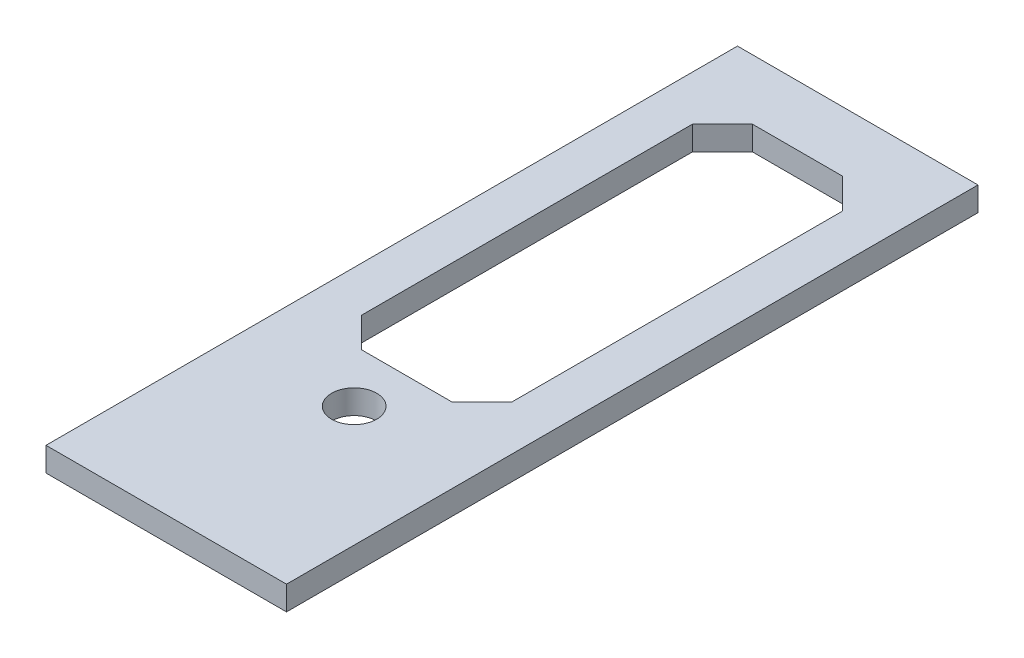
ISO-10303-21;
HEADER;
FILE_DESCRIPTION(('STEP AP214'),'2;1');
FILE_NAME('part.step','',(''),(''),'','','');
FILE_SCHEMA(('AUTOMOTIVE_DESIGN { 1 0 10303 214 1 1 1 1 }'));
ENDSEC;
DATA;
#1=APPLICATION_CONTEXT('core data for automotive mechanical design processes');
#2=APPLICATION_PROTOCOL_DEFINITION('international standard','automotive_design',2000,#1);
#3=PRODUCT_CONTEXT('',#1,'mechanical');
#4=PRODUCT('Part','Part','',(#3));
#5=PRODUCT_RELATED_PRODUCT_CATEGORY('part','',(#4));
#6=PRODUCT_DEFINITION_FORMATION('','',#4);
#7=PRODUCT_DEFINITION_CONTEXT('part definition',#1,'design');
#8=PRODUCT_DEFINITION('design','',#6,#7);
#9=PRODUCT_DEFINITION_SHAPE('','',#8);
#10=(LENGTH_UNIT() NAMED_UNIT(*) SI_UNIT(.MILLI.,.METRE.));
#11=(NAMED_UNIT(*) PLANE_ANGLE_UNIT() SI_UNIT($,.RADIAN.));
#12=(NAMED_UNIT(*) SI_UNIT($,.STERADIAN.) SOLID_ANGLE_UNIT());
#13=UNCERTAINTY_MEASURE_WITH_UNIT(LENGTH_MEASURE(1.E-05),#10,'distance_accuracy_value','');
#14=(GEOMETRIC_REPRESENTATION_CONTEXT(3) GLOBAL_UNCERTAINTY_ASSIGNED_CONTEXT((#13)) GLOBAL_UNIT_ASSIGNED_CONTEXT((#10,
#11,#12)) REPRESENTATION_CONTEXT('',''));
#15=CARTESIAN_POINT('',(0.,0.,0.));
#16=DIRECTION('',(0.,0.,1.));
#17=DIRECTION('',(1.,0.,0.));
#18=AXIS2_PLACEMENT_3D('',#15,#16,#17);
#19=CARTESIAN_POINT('',(8.,1.6,23.));
#20=DIRECTION('',(-1.,0.,0.));
#21=DIRECTION('',(0.,0.,1.));
#22=AXIS2_PLACEMENT_3D('',#19,#20,#21);
#23=PLANE('',#22);
#24=DIRECTION('',(0.,0.,-1.));
#25=VECTOR('',#24,1.);
#26=CARTESIAN_POINT('',(8.,0.,23.));
#27=LINE('',#26,#25);
#28=CARTESIAN_POINT('',(8.,0.,23.));
#29=VERTEX_POINT('',#28);
#30=CARTESIAN_POINT('',(8.,0.,-23.));
#31=VERTEX_POINT('',#30);
#32=EDGE_CURVE('E163',#29,#31,#27,.T.);
#33=ORIENTED_EDGE('',*,*,#32,.T.);
#34=DIRECTION('',(0.,-1.,0.));
#35=VECTOR('',#34,1.);
#36=CARTESIAN_POINT('',(8.,1.6,-23.));
#37=LINE('',#36,#35);
#38=CARTESIAN_POINT('',(8.,1.6,-23.));
#39=VERTEX_POINT('',#38);
#40=EDGE_CURVE('E142',#39,#31,#37,.T.);
#41=ORIENTED_EDGE('',*,*,#40,.F.);
#42=DIRECTION('',(0.,0.,-1.));
#43=VECTOR('',#42,1.);
#44=CARTESIAN_POINT('',(8.,1.6,23.));
#45=LINE('',#44,#43);
#46=CARTESIAN_POINT('',(8.,1.6,23.));
#47=VERTEX_POINT('',#46);
#48=EDGE_CURVE('E150',#47,#39,#45,.T.);
#49=ORIENTED_EDGE('',*,*,#48,.F.);
#50=DIRECTION('',(0.,-1.,0.));
#51=VECTOR('',#50,1.);
#52=CARTESIAN_POINT('',(8.,1.6,23.));
#53=LINE('',#52,#51);
#54=EDGE_CURVE('E255',#47,#29,#53,.T.);
#55=ORIENTED_EDGE('',*,*,#54,.T.);
#56=EDGE_LOOP('',(#33,#41,#49,#55));
#57=FACE_BOUND('',#56,.T.);
#58=ADVANCED_FACE('F47',(#57),#23,.F.);
#59=CARTESIAN_POINT('',(-8.,1.6,-23.));
#60=DIRECTION('',(0.,0.,1.));
#61=DIRECTION('',(1.,0.,0.));
#62=AXIS2_PLACEMENT_3D('',#59,#60,#61);
#63=PLANE('',#62);
#64=DIRECTION('',(-1.,0.,0.));
#65=VECTOR('',#64,1.);
#66=CARTESIAN_POINT('',(-8.,0.,-23.));
#67=LINE('',#66,#65);
#68=CARTESIAN_POINT('',(-8.,0.,-23.));
#69=VERTEX_POINT('',#68);
#70=EDGE_CURVE('E242',#31,#69,#67,.T.);
#71=ORIENTED_EDGE('',*,*,#70,.T.);
#72=DIRECTION('',(0.,-1.,0.));
#73=VECTOR('',#72,1.);
#74=CARTESIAN_POINT('',(-8.,1.6,-23.));
#75=LINE('',#74,#73);
#76=CARTESIAN_POINT('',(-8.,1.6,-23.));
#77=VERTEX_POINT('',#76);
#78=EDGE_CURVE('E145',#77,#69,#75,.T.);
#79=ORIENTED_EDGE('',*,*,#78,.F.);
#80=DIRECTION('',(-1.,0.,0.));
#81=VECTOR('',#80,1.);
#82=CARTESIAN_POINT('',(-8.,1.6,-23.));
#83=LINE('',#82,#81);
#84=EDGE_CURVE('E138',#39,#77,#83,.T.);
#85=ORIENTED_EDGE('',*,*,#84,.F.);
#86=ORIENTED_EDGE('',*,*,#40,.T.);
#87=EDGE_LOOP('',(#71,#79,#85,#86));
#88=FACE_BOUND('',#87,.T.);
#89=ADVANCED_FACE('F140',(#88),#63,.F.);
#90=CARTESIAN_POINT('',(-8.,1.6,23.));
#91=DIRECTION('',(1.,0.,0.));
#92=DIRECTION('',(0.,0.,-1.));
#93=AXIS2_PLACEMENT_3D('',#90,#91,#92);
#94=PLANE('',#93);
#95=DIRECTION('',(0.,0.,1.));
#96=VECTOR('',#95,1.);
#97=CARTESIAN_POINT('',(-8.,0.,23.));
#98=LINE('',#97,#96);
#99=CARTESIAN_POINT('',(-8.,0.,23.));
#100=VERTEX_POINT('',#99);
#101=EDGE_CURVE('E259',#69,#100,#98,.T.);
#102=ORIENTED_EDGE('',*,*,#101,.T.);
#103=DIRECTION('',(0.,-1.,0.));
#104=VECTOR('',#103,1.);
#105=CARTESIAN_POINT('',(-8.,1.6,23.));
#106=LINE('',#105,#104);
#107=CARTESIAN_POINT('',(-8.,1.6,23.));
#108=VERTEX_POINT('',#107);
#109=EDGE_CURVE('E171',#108,#100,#106,.T.);
#110=ORIENTED_EDGE('',*,*,#109,.F.);
#111=DIRECTION('',(0.,0.,1.));
#112=VECTOR('',#111,1.);
#113=CARTESIAN_POINT('',(-8.,1.6,23.));
#114=LINE('',#113,#112);
#115=EDGE_CURVE('E149',#77,#108,#114,.T.);
#116=ORIENTED_EDGE('',*,*,#115,.F.);
#117=ORIENTED_EDGE('',*,*,#78,.T.);
#118=EDGE_LOOP('',(#102,#110,#116,#117));
#119=FACE_BOUND('',#118,.T.);
#120=ADVANCED_FACE('F275',(#119),#94,.F.);
#121=CARTESIAN_POINT('',(-8.,1.6,23.));
#122=DIRECTION('',(0.,0.,-1.));
#123=DIRECTION('',(-1.,0.,0.));
#124=AXIS2_PLACEMENT_3D('',#121,#122,#123);
#125=PLANE('',#124);
#126=DIRECTION('',(1.,0.,0.));
#127=VECTOR('',#126,1.);
#128=CARTESIAN_POINT('',(-8.,0.,23.));
#129=LINE('',#128,#127);
#130=EDGE_CURVE('E160',#100,#29,#129,.T.);
#131=ORIENTED_EDGE('',*,*,#130,.T.);
#132=ORIENTED_EDGE('',*,*,#54,.F.);
#133=DIRECTION('',(1.,0.,0.));
#134=VECTOR('',#133,1.);
#135=CARTESIAN_POINT('',(-8.,1.6,23.));
#136=LINE('',#135,#134);
#137=EDGE_CURVE('E155',#108,#47,#136,.T.);
#138=ORIENTED_EDGE('',*,*,#137,.F.);
#139=ORIENTED_EDGE('',*,*,#109,.T.);
#140=EDGE_LOOP('',(#131,#132,#138,#139));
#141=FACE_BOUND('',#140,.T.);
#142=ADVANCED_FACE('F270',(#141),#125,.F.);
#143=CARTESIAN_POINT('',(0.,1.6,0.));
#144=DIRECTION('',(0.,-1.,0.));
#145=DIRECTION('',(0.,0.,-1.));
#146=AXIS2_PLACEMENT_3D('',#143,#144,#145);
#147=PLANE('',#146);
#148=CARTESIAN_POINT('',(0.,1.6,10.5));
#149=DIRECTION('',(0.,1.,0.));
#150=DIRECTION('',(0.,0.,1.));
#151=AXIS2_PLACEMENT_3D('',#148,#149,#150);
#152=CIRCLE('',#151,1.5);
#153=CARTESIAN_POINT('',(0.,1.6,12.));
#154=VERTEX_POINT('',#153);
#155=EDGE_CURVE('E333',#154,#154,#152,.T.);
#156=ORIENTED_EDGE('',*,*,#155,.F.);
#157=EDGE_LOOP('',(#156));
#158=FACE_BOUND('',#157,.T.);
#159=DIRECTION('',(0.,0.,-1.));
#160=VECTOR('',#159,1.);
#161=CARTESIAN_POINT('',(5.,1.6,-19.));
#162=LINE('',#161,#160);
#163=CARTESIAN_POINT('',(5.,1.6,4.99999999999999));
#164=VERTEX_POINT('',#163);
#165=CARTESIAN_POINT('',(5.,1.6,-17.));
#166=VERTEX_POINT('',#165);
#167=EDGE_CURVE('E232',#164,#166,#162,.T.);
#168=ORIENTED_EDGE('',*,*,#167,.F.);
#169=DIRECTION('',(0.707106781186544,0.,-0.707106781186551));
#170=VECTOR('',#169,1.);
#171=CARTESIAN_POINT('',(5.00000000000003,1.6,4.99999999999998));
#172=LINE('',#171,#170);
#173=CARTESIAN_POINT('',(3.00000000000002,1.6,7.));
#174=VERTEX_POINT('',#173);
#175=EDGE_CURVE('E204',#164,#174,#172,.F.);
#176=ORIENTED_EDGE('',*,*,#175,.T.);
#177=DIRECTION('',(1.,0.,0.));
#178=VECTOR('',#177,1.);
#179=CARTESIAN_POINT('',(-5.,1.6,7.));
#180=LINE('',#179,#178);
#181=CARTESIAN_POINT('',(-3.,1.6,7.));
#182=VERTEX_POINT('',#181);
#183=EDGE_CURVE('E325',#182,#174,#180,.T.);
#184=ORIENTED_EDGE('',*,*,#183,.F.);
#185=DIRECTION('',(0.70710678118655,0.,0.707106781186545));
#186=VECTOR('',#185,1.);
#187=CARTESIAN_POINT('',(-4.99999999999999,1.6,5.00000000000003));
#188=LINE('',#187,#186);
#189=CARTESIAN_POINT('',(-5.,1.6,5.00000000000002));
#190=VERTEX_POINT('',#189);
#191=EDGE_CURVE('E210',#182,#190,#188,.F.);
#192=ORIENTED_EDGE('',*,*,#191,.T.);
#193=DIRECTION('',(0.,0.,1.));
#194=VECTOR('',#193,1.);
#195=CARTESIAN_POINT('',(-5.,1.6,-19.));
#196=LINE('',#195,#194);
#197=CARTESIAN_POINT('',(-5.,1.6,-17.));
#198=VERTEX_POINT('',#197);
#199=EDGE_CURVE('E222',#198,#190,#196,.T.);
#200=ORIENTED_EDGE('',*,*,#199,.F.);
#201=DIRECTION('',(-0.707106781186544,0.,0.707106781186551));
#202=VECTOR('',#201,1.);
#203=CARTESIAN_POINT('',(-11.,1.6,-10.9999999999999));
#204=LINE('',#203,#202);
#205=CARTESIAN_POINT('',(-3.00000000000002,1.6,-19.));
#206=VERTEX_POINT('',#205);
#207=EDGE_CURVE('E57',#198,#206,#204,.F.);
#208=ORIENTED_EDGE('',*,*,#207,.T.);
#209=DIRECTION('',(-1.,0.,0.));
#210=VECTOR('',#209,1.);
#211=CARTESIAN_POINT('',(-5.,1.6,-19.));
#212=LINE('',#211,#210);
#213=CARTESIAN_POINT('',(2.99999999999999,1.6,-19.));
#214=VERTEX_POINT('',#213);
#215=EDGE_CURVE('E221',#214,#206,#212,.T.);
#216=ORIENTED_EDGE('',*,*,#215,.F.);
#217=DIRECTION('',(-0.70710678118655,0.,-0.707106781186545));
#218=VECTOR('',#217,1.);
#219=CARTESIAN_POINT('',(11.,1.6,-11.0000000000001));
#220=LINE('',#219,#218);
#221=EDGE_CURVE('E198',#214,#166,#220,.F.);
#222=ORIENTED_EDGE('',*,*,#221,.T.);
#223=EDGE_LOOP('',(#168,#176,#184,#192,#200,#208,#216,#222));
#224=FACE_BOUND('',#223,.T.);
#225=ORIENTED_EDGE('',*,*,#48,.T.);
#226=ORIENTED_EDGE('',*,*,#84,.T.);
#227=ORIENTED_EDGE('',*,*,#115,.T.);
#228=ORIENTED_EDGE('',*,*,#137,.T.);
#229=EDGE_LOOP('',(#225,#226,#227,#228));
#230=FACE_BOUND('',#229,.T.);
#231=ADVANCED_FACE('F153',(#158,#224,#230),#147,.F.);
#232=CARTESIAN_POINT('',(0.,0.,0.));
#233=DIRECTION('',(0.,-1.,0.));
#234=DIRECTION('',(0.,0.,-1.));
#235=AXIS2_PLACEMENT_3D('',#232,#233,#234);
#236=PLANE('',#235);
#237=CARTESIAN_POINT('',(0.,0.,10.5));
#238=DIRECTION('',(0.,-1.,0.));
#239=DIRECTION('',(0.,0.,-1.));
#240=AXIS2_PLACEMENT_3D('',#237,#238,#239);
#241=CIRCLE('',#240,1.5);
#242=CARTESIAN_POINT('',(0.,0.,12.));
#243=VERTEX_POINT('',#242);
#244=EDGE_CURVE('E330',#243,#243,#241,.F.);
#245=ORIENTED_EDGE('',*,*,#244,.T.);
#246=EDGE_LOOP('',(#245));
#247=FACE_BOUND('',#246,.T.);
#248=DIRECTION('',(0.,0.,1.));
#249=VECTOR('',#248,1.);
#250=CARTESIAN_POINT('',(-5.,0.,-19.));
#251=LINE('',#250,#249);
#252=CARTESIAN_POINT('',(-5.,0.,-17.));
#253=VERTEX_POINT('',#252);
#254=CARTESIAN_POINT('',(-5.,0.,5.00000000000002));
#255=VERTEX_POINT('',#254);
#256=EDGE_CURVE('E235',#253,#255,#251,.T.);
#257=ORIENTED_EDGE('',*,*,#256,.T.);
#258=DIRECTION('',(-0.70710678118655,0.,-0.707106781186545));
#259=VECTOR('',#258,1.);
#260=CARTESIAN_POINT('',(-3.,0.,7.));
#261=LINE('',#260,#259);
#262=CARTESIAN_POINT('',(-3.,0.,7.));
#263=VERTEX_POINT('',#262);
#264=EDGE_CURVE('E213',#255,#263,#261,.F.);
#265=ORIENTED_EDGE('',*,*,#264,.T.);
#266=DIRECTION('',(1.,0.,0.));
#267=VECTOR('',#266,1.);
#268=CARTESIAN_POINT('',(-5.,0.,7.));
#269=LINE('',#268,#267);
#270=CARTESIAN_POINT('',(3.00000000000002,0.,7.));
#271=VERTEX_POINT('',#270);
#272=EDGE_CURVE('E231',#263,#271,#269,.T.);
#273=ORIENTED_EDGE('',*,*,#272,.T.);
#274=DIRECTION('',(-0.707106781186544,0.,0.707106781186551));
#275=VECTOR('',#274,1.);
#276=CARTESIAN_POINT('',(5.,0.,5.));
#277=LINE('',#276,#275);
#278=CARTESIAN_POINT('',(5.,0.,5.));
#279=VERTEX_POINT('',#278);
#280=EDGE_CURVE('E207',#271,#279,#277,.F.);
#281=ORIENTED_EDGE('',*,*,#280,.T.);
#282=DIRECTION('',(0.,0.,-1.));
#283=VECTOR('',#282,1.);
#284=CARTESIAN_POINT('',(5.,0.,-19.));
#285=LINE('',#284,#283);
#286=CARTESIAN_POINT('',(5.,0.,-17.));
#287=VERTEX_POINT('',#286);
#288=EDGE_CURVE('E244',#279,#287,#285,.T.);
#289=ORIENTED_EDGE('',*,*,#288,.T.);
#290=DIRECTION('',(0.70710678118655,0.,0.707106781186545));
#291=VECTOR('',#290,1.);
#292=CARTESIAN_POINT('',(2.99999999999999,0.,-19.));
#293=LINE('',#292,#291);
#294=CARTESIAN_POINT('',(2.99999999999999,0.,-19.));
#295=VERTEX_POINT('',#294);
#296=EDGE_CURVE('E201',#287,#295,#293,.F.);
#297=ORIENTED_EDGE('',*,*,#296,.T.);
#298=DIRECTION('',(-1.,0.,0.));
#299=VECTOR('',#298,1.);
#300=CARTESIAN_POINT('',(-5.,0.,-19.));
#301=LINE('',#300,#299);
#302=CARTESIAN_POINT('',(-3.00000000000002,0.,-19.));
#303=VERTEX_POINT('',#302);
#304=EDGE_CURVE('E238',#295,#303,#301,.T.);
#305=ORIENTED_EDGE('',*,*,#304,.T.);
#306=DIRECTION('',(0.707106781186544,0.,-0.707106781186551));
#307=VECTOR('',#306,1.);
#308=CARTESIAN_POINT('',(-5.,0.,-17.));
#309=LINE('',#308,#307);
#310=EDGE_CURVE('E11',#303,#253,#309,.F.);
#311=ORIENTED_EDGE('',*,*,#310,.T.);
#312=EDGE_LOOP('',(#257,#265,#273,#281,#289,#297,#305,#311));
#313=FACE_BOUND('',#312,.T.);
#314=ORIENTED_EDGE('',*,*,#32,.F.);
#315=ORIENTED_EDGE('',*,*,#130,.F.);
#316=ORIENTED_EDGE('',*,*,#101,.F.);
#317=ORIENTED_EDGE('',*,*,#70,.F.);
#318=EDGE_LOOP('',(#314,#315,#316,#317));
#319=FACE_BOUND('',#318,.T.);
#320=ADVANCED_FACE('F274',(#247,#313,#319),#236,.T.);
#321=CARTESIAN_POINT('',(-5.,-27.8567765543682,7.));
#322=DIRECTION('',(0.,0.,1.));
#323=DIRECTION('',(1.,0.,0.));
#324=AXIS2_PLACEMENT_3D('',#321,#322,#323);
#325=PLANE('',#324);
#326=ORIENTED_EDGE('',*,*,#183,.T.);
#327=DIRECTION('',(0.,-1.,0.));
#328=VECTOR('',#327,1.);
#329=CARTESIAN_POINT('',(3.00000000000002,0.,7.));
#330=LINE('',#329,#328);
#331=EDGE_CURVE('E189',#174,#271,#330,.T.);
#332=ORIENTED_EDGE('',*,*,#331,.T.);
#333=ORIENTED_EDGE('',*,*,#272,.F.);
#334=DIRECTION('',(0.,1.,0.));
#335=VECTOR('',#334,1.);
#336=CARTESIAN_POINT('',(-3.,1.6,7.));
#337=LINE('',#336,#335);
#338=EDGE_CURVE('E185',#263,#182,#337,.T.);
#339=ORIENTED_EDGE('',*,*,#338,.T.);
#340=EDGE_LOOP('',(#326,#332,#333,#339));
#341=FACE_BOUND('',#340,.T.);
#342=ADVANCED_FACE('F318',(#341),#325,.F.);
#343=CARTESIAN_POINT('',(5.,-27.8567765543682,-19.));
#344=DIRECTION('',(1.,0.,0.));
#345=DIRECTION('',(0.,0.,-1.));
#346=AXIS2_PLACEMENT_3D('',#343,#344,#345);
#347=PLANE('',#346);
#348=ORIENTED_EDGE('',*,*,#167,.T.);
#349=DIRECTION('',(0.,-1.,0.));
#350=VECTOR('',#349,1.);
#351=CARTESIAN_POINT('',(5.,0.,-17.));
#352=LINE('',#351,#350);
#353=EDGE_CURVE('E182',#166,#287,#352,.T.);
#354=ORIENTED_EDGE('',*,*,#353,.T.);
#355=ORIENTED_EDGE('',*,*,#288,.F.);
#356=DIRECTION('',(0.,1.,0.));
#357=VECTOR('',#356,1.);
#358=CARTESIAN_POINT('',(5.,1.6,5.));
#359=LINE('',#358,#357);
#360=EDGE_CURVE('E178',#279,#164,#359,.T.);
#361=ORIENTED_EDGE('',*,*,#360,.T.);
#362=EDGE_LOOP('',(#348,#354,#355,#361));
#363=FACE_BOUND('',#362,.T.);
#364=ADVANCED_FACE('F351',(#363),#347,.F.);
#365=CARTESIAN_POINT('',(-5.,-27.8567765543682,-19.));
#366=DIRECTION('',(0.,0.,-1.));
#367=DIRECTION('',(-1.,0.,0.));
#368=AXIS2_PLACEMENT_3D('',#365,#366,#367);
#369=PLANE('',#368);
#370=ORIENTED_EDGE('',*,*,#304,.F.);
#371=DIRECTION('',(0.,1.,0.));
#372=VECTOR('',#371,1.);
#373=CARTESIAN_POINT('',(2.99999999999999,1.6,-19.));
#374=LINE('',#373,#372);
#375=EDGE_CURVE('E169',#295,#214,#374,.T.);
#376=ORIENTED_EDGE('',*,*,#375,.T.);
#377=ORIENTED_EDGE('',*,*,#215,.T.);
#378=DIRECTION('',(0.,-1.,0.));
#379=VECTOR('',#378,1.);
#380=CARTESIAN_POINT('',(-3.00000000000002,0.,-19.));
#381=LINE('',#380,#379);
#382=EDGE_CURVE('E165',#206,#303,#381,.T.);
#383=ORIENTED_EDGE('',*,*,#382,.T.);
#384=EDGE_LOOP('',(#370,#376,#377,#383));
#385=FACE_BOUND('',#384,.T.);
#386=ADVANCED_FACE('F228',(#385),#369,.F.);
#387=CARTESIAN_POINT('',(-5.,-27.8567765543682,-19.));
#388=DIRECTION('',(-1.,0.,0.));
#389=DIRECTION('',(0.,0.,1.));
#390=AXIS2_PLACEMENT_3D('',#387,#388,#389);
#391=PLANE('',#390);
#392=ORIENTED_EDGE('',*,*,#199,.T.);
#393=DIRECTION('',(0.,-1.,0.));
#394=VECTOR('',#393,1.);
#395=CARTESIAN_POINT('',(-5.,0.,5.00000000000002));
#396=LINE('',#395,#394);
#397=EDGE_CURVE('E64',#190,#255,#396,.T.);
#398=ORIENTED_EDGE('',*,*,#397,.T.);
#399=ORIENTED_EDGE('',*,*,#256,.F.);
#400=DIRECTION('',(0.,1.,0.));
#401=VECTOR('',#400,1.);
#402=CARTESIAN_POINT('',(-5.,1.6,-17.));
#403=LINE('',#402,#401);
#404=EDGE_CURVE('E192',#253,#198,#403,.T.);
#405=ORIENTED_EDGE('',*,*,#404,.T.);
#406=EDGE_LOOP('',(#392,#398,#399,#405));
#407=FACE_BOUND('',#406,.T.);
#408=ADVANCED_FACE('F234',(#407),#391,.F.);
#409=CARTESIAN_POINT('',(2.99999999999999,-27.8567765543682,-19.));
#410=DIRECTION('',(-0.707106781186545,0.,0.70710678118655));
#411=DIRECTION('',(0.,-1.,0.));
#412=AXIS2_PLACEMENT_3D('',#409,#410,#411);
#413=PLANE('',#412);
#414=ORIENTED_EDGE('',*,*,#296,.F.);
#415=ORIENTED_EDGE('',*,*,#353,.F.);
#416=ORIENTED_EDGE('',*,*,#221,.F.);
#417=ORIENTED_EDGE('',*,*,#375,.F.);
#418=EDGE_LOOP('',(#414,#415,#416,#417));
#419=FACE_BOUND('',#418,.T.);
#420=ADVANCED_FACE('F290',(#419),#413,.T.);
#421=CARTESIAN_POINT('',(5.,-27.8567765543682,5.));
#422=DIRECTION('',(-0.707106781186551,0.,-0.707106781186544));
#423=DIRECTION('',(0.,-1.,0.));
#424=AXIS2_PLACEMENT_3D('',#421,#422,#423);
#425=PLANE('',#424);
#426=ORIENTED_EDGE('',*,*,#280,.F.);
#427=ORIENTED_EDGE('',*,*,#331,.F.);
#428=ORIENTED_EDGE('',*,*,#175,.F.);
#429=ORIENTED_EDGE('',*,*,#360,.F.);
#430=EDGE_LOOP('',(#426,#427,#428,#429));
#431=FACE_BOUND('',#430,.T.);
#432=ADVANCED_FACE('F296',(#431),#425,.T.);
#433=CARTESIAN_POINT('',(-3.,-27.8567765543682,7.));
#434=DIRECTION('',(0.707106781186545,0.,-0.70710678118655));
#435=DIRECTION('',(0.,-1.,0.));
#436=AXIS2_PLACEMENT_3D('',#433,#434,#435);
#437=PLANE('',#436);
#438=ORIENTED_EDGE('',*,*,#264,.F.);
#439=ORIENTED_EDGE('',*,*,#397,.F.);
#440=ORIENTED_EDGE('',*,*,#191,.F.);
#441=ORIENTED_EDGE('',*,*,#338,.F.);
#442=EDGE_LOOP('',(#438,#439,#440,#441));
#443=FACE_BOUND('',#442,.T.);
#444=ADVANCED_FACE('F302',(#443),#437,.T.);
#445=CARTESIAN_POINT('',(-5.,-27.8567765543682,-17.));
#446=DIRECTION('',(0.707106781186551,0.,0.707106781186544));
#447=DIRECTION('',(0.,-1.,0.));
#448=AXIS2_PLACEMENT_3D('',#445,#446,#447);
#449=PLANE('',#448);
#450=ORIENTED_EDGE('',*,*,#310,.F.);
#451=ORIENTED_EDGE('',*,*,#382,.F.);
#452=ORIENTED_EDGE('',*,*,#207,.F.);
#453=ORIENTED_EDGE('',*,*,#404,.F.);
#454=EDGE_LOOP('',(#450,#451,#452,#453));
#455=FACE_BOUND('',#454,.T.);
#456=ADVANCED_FACE('F50',(#455),#449,.T.);
#457=CARTESIAN_POINT('',(0.,-4.24264068711928,10.5));
#458=DIRECTION('',(0.,1.,0.));
#459=DIRECTION('',(0.,0.,1.));
#460=AXIS2_PLACEMENT_3D('',#457,#458,#459);
#461=CYLINDRICAL_SURFACE('',#460,1.5);
#462=CARTESIAN_POINT('',(0.,1.6,12.));
#463=CARTESIAN_POINT('',(0.,1.58333333333333,12.));
#464=CARTESIAN_POINT('',(0.,1.56666666666667,12.));
#465=CARTESIAN_POINT('',(0.,1.53333333333333,12.));
#466=CARTESIAN_POINT('',(0.,1.51666666666667,12.));
#467=CARTESIAN_POINT('',(0.,1.48333333333333,12.));
#468=CARTESIAN_POINT('',(0.,1.46666666666667,12.));
#469=CARTESIAN_POINT('',(0.,1.43333333333333,12.));
#470=CARTESIAN_POINT('',(0.,1.41666666666667,12.));
#471=CARTESIAN_POINT('',(0.,1.38333333333333,12.));
#472=CARTESIAN_POINT('',(0.,1.36666666666667,12.));
#473=CARTESIAN_POINT('',(0.,1.33333333333333,12.));
#474=CARTESIAN_POINT('',(0.,1.31666666666667,12.));
#475=CARTESIAN_POINT('',(0.,1.28333333333333,12.));
#476=CARTESIAN_POINT('',(0.,1.26666666666667,12.));
#477=CARTESIAN_POINT('',(0.,1.23333333333333,12.));
#478=CARTESIAN_POINT('',(0.,1.21666666666667,12.));
#479=CARTESIAN_POINT('',(0.,1.18333333333333,12.));
#480=CARTESIAN_POINT('',(0.,1.16666666666667,12.));
#481=CARTESIAN_POINT('',(0.,1.13333333333333,12.));
#482=CARTESIAN_POINT('',(0.,1.11666666666667,12.));
#483=CARTESIAN_POINT('',(0.,1.08333333333333,12.));
#484=CARTESIAN_POINT('',(0.,1.06666666666667,12.));
#485=CARTESIAN_POINT('',(0.,1.03333333333333,12.));
#486=CARTESIAN_POINT('',(0.,1.01666666666667,12.));
#487=CARTESIAN_POINT('',(0.,0.983333333333334,12.));
#488=CARTESIAN_POINT('',(0.,0.966666666666667,12.));
#489=CARTESIAN_POINT('',(0.,0.933333333333334,12.));
#490=CARTESIAN_POINT('',(0.,0.916666666666667,12.));
#491=CARTESIAN_POINT('',(0.,0.883333333333334,12.));
#492=CARTESIAN_POINT('',(0.,0.866666666666667,12.));
#493=CARTESIAN_POINT('',(0.,0.833333333333333,12.));
#494=CARTESIAN_POINT('',(0.,0.816666666666667,12.));
#495=CARTESIAN_POINT('',(0.,0.783333333333334,12.));
#496=CARTESIAN_POINT('',(0.,0.766666666666667,12.));
#497=CARTESIAN_POINT('',(0.,0.733333333333334,12.));
#498=CARTESIAN_POINT('',(0.,0.716666666666667,12.));
#499=CARTESIAN_POINT('',(0.,0.683333333333334,12.));
#500=CARTESIAN_POINT('',(0.,0.666666666666667,12.));
#501=CARTESIAN_POINT('',(0.,0.633333333333334,12.));
#502=CARTESIAN_POINT('',(0.,0.616666666666667,12.));
#503=CARTESIAN_POINT('',(0.,0.583333333333333,12.));
#504=CARTESIAN_POINT('',(0.,0.566666666666667,12.));
#505=CARTESIAN_POINT('',(0.,0.533333333333334,12.));
#506=CARTESIAN_POINT('',(0.,0.516666666666667,12.));
#507=CARTESIAN_POINT('',(0.,0.483333333333334,12.));
#508=CARTESIAN_POINT('',(0.,0.466666666666667,12.));
#509=CARTESIAN_POINT('',(0.,0.433333333333334,12.));
#510=CARTESIAN_POINT('',(0.,0.416666666666667,12.));
#511=CARTESIAN_POINT('',(0.,0.383333333333333,12.));
#512=CARTESIAN_POINT('',(0.,0.366666666666666,12.));
#513=CARTESIAN_POINT('',(0.,0.333333333333333,12.));
#514=CARTESIAN_POINT('',(0.,0.316666666666666,12.));
#515=CARTESIAN_POINT('',(0.,0.283333333333333,12.));
#516=CARTESIAN_POINT('',(0.,0.266666666666667,12.));
#517=CARTESIAN_POINT('',(0.,0.233333333333334,12.));
#518=CARTESIAN_POINT('',(0.,0.216666666666667,12.));
#519=CARTESIAN_POINT('',(0.,0.183333333333334,12.));
#520=CARTESIAN_POINT('',(0.,0.166666666666667,12.));
#521=CARTESIAN_POINT('',(0.,0.133333333333333,12.));
#522=CARTESIAN_POINT('',(0.,0.116666666666667,12.));
#523=CARTESIAN_POINT('',(0.,0.0833333333333334,12.));
#524=CARTESIAN_POINT('',(0.,0.0666666666666666,12.));
#525=CARTESIAN_POINT('',(0.,0.0333333333333331,12.));
#526=CARTESIAN_POINT('',(0.,0.0166666666666665,12.));
#527=CARTESIAN_POINT('',(0.,0.,12.));
#528=B_SPLINE_CURVE_WITH_KNOTS('',3,(#462,#463,#464,#465,#466,#467,#468,#469,#470,#471,#472,
#473,#474,#475,#476,#477,#478,#479,#480,#481,#482,#483,#484,#485,#486,#487,#488,#489,#490,#491,
#492,#493,#494,#495,#496,#497,#498,#499,#500,#501,#502,#503,#504,#505,#506,#507,#508,#509,#510,
#511,#512,#513,#514,#515,#516,#517,#518,#519,#520,#521,#522,#523,#524,#525,#526,#527),
.UNSPECIFIED.,.F.,.F.,(4,2,2,2,2,2,2,2,2,2,2,2,2,2,2,2,2,2,2,2,2,2,2,2,2,2,2,2,2,2,2,2,4),(0.,
0.0499999999999997,0.1,0.15,0.200000000000001,0.25,0.3,0.35,0.4,0.45,0.5,0.55,0.6,0.65,0.7,
0.750000000000001,0.8,0.85,0.900000000000001,0.95,1.,1.05,1.1,1.15,1.2,1.25,1.3,1.35,1.4,1.45,
1.5,1.55,1.6),.UNSPECIFIED.);
#529=EDGE_CURVE('BSEAM311',#154,#243,#528,.T.);
#530=ORIENTED_EDGE('',*,*,#155,.T.);
#531=ORIENTED_EDGE('',*,*,#244,.F.);
#532=ORIENTED_EDGE('',*,*,#529,.T.);
#533=ORIENTED_EDGE('',*,*,#529,.F.);
#534=EDGE_LOOP('',(#530,#532,#531,#533));
#535=FACE_BOUND('',#534,.T.);
#536=ADVANCED_FACE('F311',(#535),#461,.F.);
#537=CLOSED_SHELL('',(#58,#89,#120,#142,#231,#320,#342,#364,#386,#408,#420,#432,#444,#456,#536));
#538=MANIFOLD_SOLID_BREP('B2',#537);
#539=ADVANCED_BREP_SHAPE_REPRESENTATION('',(#18,#538),#14);
#540=SHAPE_DEFINITION_REPRESENTATION(#9,#539);
ENDSEC;
END-ISO-10303-21;
